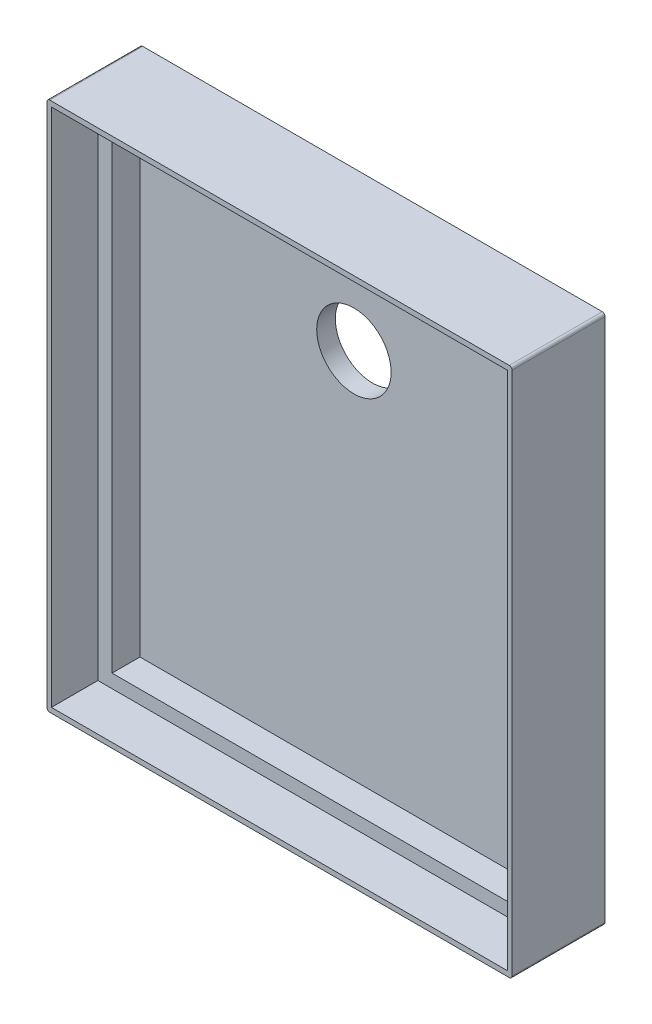
ISO-10303-21;
HEADER;
FILE_DESCRIPTION(('STEP AP214'),'2;1');
FILE_NAME('part.step','',(''),(''),'','','');
FILE_SCHEMA(('AUTOMOTIVE_DESIGN { 1 0 10303 214 1 1 1 1 }'));
ENDSEC;
DATA;
#1=APPLICATION_CONTEXT('core data for automotive mechanical design processes');
#2=APPLICATION_PROTOCOL_DEFINITION('international standard','automotive_design',2000,#1);
#3=PRODUCT_CONTEXT('',#1,'mechanical');
#4=PRODUCT('Part','Part','',(#3));
#5=PRODUCT_RELATED_PRODUCT_CATEGORY('part','',(#4));
#6=PRODUCT_DEFINITION_FORMATION('','',#4);
#7=PRODUCT_DEFINITION_CONTEXT('part definition',#1,'design');
#8=PRODUCT_DEFINITION('design','',#6,#7);
#9=PRODUCT_DEFINITION_SHAPE('','',#8);
#10=(LENGTH_UNIT() NAMED_UNIT(*) SI_UNIT(.MILLI.,.METRE.));
#11=(NAMED_UNIT(*) PLANE_ANGLE_UNIT() SI_UNIT($,.RADIAN.));
#12=(NAMED_UNIT(*) SI_UNIT($,.STERADIAN.) SOLID_ANGLE_UNIT());
#13=UNCERTAINTY_MEASURE_WITH_UNIT(LENGTH_MEASURE(1.E-05),#10,'distance_accuracy_value','');
#14=(GEOMETRIC_REPRESENTATION_CONTEXT(3) GLOBAL_UNCERTAINTY_ASSIGNED_CONTEXT((#13)) GLOBAL_UNIT_ASSIGNED_CONTEXT((#10,
#11,#12)) REPRESENTATION_CONTEXT('',''));
#15=CARTESIAN_POINT('',(0.,0.,0.));
#16=DIRECTION('',(0.,0.,1.));
#17=DIRECTION('',(1.,0.,0.));
#18=AXIS2_PLACEMENT_3D('',#15,#16,#17);
#19=CARTESIAN_POINT('',(497.,-567.,100.));
#20=DIRECTION('',(0.,0.,1.));
#21=DIRECTION('',(1.,0.,0.));
#22=AXIS2_PLACEMENT_3D('',#19,#20,#21);
#23=PLANE('',#22);
#24=CARTESIAN_POINT('',(497.,-567.,100.));
#25=DIRECTION('',(0.,0.,1.));
#26=DIRECTION('',(1.,0.,0.));
#27=AXIS2_PLACEMENT_3D('',#24,#25,#26);
#28=CIRCLE('',#27,3.);
#29=CARTESIAN_POINT('',(497.,-570.,100.));
#30=VERTEX_POINT('',#29);
#31=CARTESIAN_POINT('',(500.,-567.,100.));
#32=VERTEX_POINT('',#31);
#33=EDGE_CURVE('E243',#30,#32,#28,.T.);
#34=ORIENTED_EDGE('',*,*,#33,.T.);
#35=DIRECTION('',(0.,1.,0.));
#36=VECTOR('',#35,1.);
#37=CARTESIAN_POINT('',(500.,-3.00000000000002,100.));
#38=LINE('',#37,#36);
#39=CARTESIAN_POINT('',(500.,-3.00000000000002,100.));
#40=VERTEX_POINT('',#39);
#41=EDGE_CURVE('E247',#32,#40,#38,.T.);
#42=ORIENTED_EDGE('',*,*,#41,.T.);
#43=CARTESIAN_POINT('',(497.,-3.,100.));
#44=DIRECTION('',(0.,0.,1.));
#45=DIRECTION('',(-1.,0.,0.));
#46=AXIS2_PLACEMENT_3D('',#43,#44,#45);
#47=CIRCLE('',#46,3.);
#48=CARTESIAN_POINT('',(497.,0.,100.));
#49=VERTEX_POINT('',#48);
#50=EDGE_CURVE('E251',#40,#49,#47,.T.);
#51=ORIENTED_EDGE('',*,*,#50,.T.);
#52=DIRECTION('',(-1.,0.,0.));
#53=VECTOR('',#52,1.);
#54=CARTESIAN_POINT('',(3.00000000000002,0.,100.));
#55=LINE('',#54,#53);
#56=CARTESIAN_POINT('',(3.00000000000002,0.,100.));
#57=VERTEX_POINT('',#56);
#58=EDGE_CURVE('E254',#49,#57,#55,.T.);
#59=ORIENTED_EDGE('',*,*,#58,.T.);
#60=CARTESIAN_POINT('',(3.,-3.,100.));
#61=DIRECTION('',(0.,0.,1.));
#62=DIRECTION('',(-1.,0.,0.));
#63=AXIS2_PLACEMENT_3D('',#60,#61,#62);
#64=CIRCLE('',#63,3.);
#65=CARTESIAN_POINT('',(0.,-3.00000000000002,100.));
#66=VERTEX_POINT('',#65);
#67=EDGE_CURVE('E257',#57,#66,#64,.T.);
#68=ORIENTED_EDGE('',*,*,#67,.T.);
#69=DIRECTION('',(0.,-1.,0.));
#70=VECTOR('',#69,1.);
#71=CARTESIAN_POINT('',(0.,-3.00000000000002,100.));
#72=LINE('',#71,#70);
#73=CARTESIAN_POINT('',(0.,-567.,100.));
#74=VERTEX_POINT('',#73);
#75=EDGE_CURVE('E260',#66,#74,#72,.T.);
#76=ORIENTED_EDGE('',*,*,#75,.T.);
#77=CARTESIAN_POINT('',(3.00000000000007,-567.,100.));
#78=DIRECTION('',(0.,0.,1.));
#79=DIRECTION('',(-1.,0.,0.));
#80=AXIS2_PLACEMENT_3D('',#77,#78,#79);
#81=CIRCLE('',#80,3.);
#82=CARTESIAN_POINT('',(3.00000000000009,-570.,100.));
#83=VERTEX_POINT('',#82);
#84=EDGE_CURVE('E263',#74,#83,#81,.T.);
#85=ORIENTED_EDGE('',*,*,#84,.T.);
#86=DIRECTION('',(1.,0.,0.));
#87=VECTOR('',#86,1.);
#88=CARTESIAN_POINT('',(3.00000000000009,-570.,100.));
#89=LINE('',#88,#87);
#90=EDGE_CURVE('E266',#83,#30,#89,.T.);
#91=ORIENTED_EDGE('',*,*,#90,.T.);
#92=EDGE_LOOP('',(#34,#42,#51,#59,#68,#76,#85,#91));
#93=FACE_BOUND('',#92,.T.);
#94=DIRECTION('',(0.,-1.,0.));
#95=VECTOR('',#94,1.);
#96=CARTESIAN_POINT('',(4.78499999999998,0.,100.));
#97=LINE('',#96,#95);
#98=CARTESIAN_POINT('',(4.78499999999998,-5.48999999999999,100.));
#99=VERTEX_POINT('',#98);
#100=CARTESIAN_POINT('',(4.78499999999998,-564.51,100.));
#101=VERTEX_POINT('',#100);
#102=EDGE_CURVE('E185',#99,#101,#97,.T.);
#103=ORIENTED_EDGE('',*,*,#102,.F.);
#104=DIRECTION('',(1.,0.,0.));
#105=VECTOR('',#104,1.);
#106=CARTESIAN_POINT('',(0.,-5.48999999999994,100.));
#107=LINE('',#106,#105);
#108=CARTESIAN_POINT('',(495.215,-5.48999999999994,100.));
#109=VERTEX_POINT('',#108);
#110=EDGE_CURVE('E55',#99,#109,#107,.T.);
#111=ORIENTED_EDGE('',*,*,#110,.T.);
#112=DIRECTION('',(0.,1.,0.));
#113=VECTOR('',#112,1.);
#114=CARTESIAN_POINT('',(495.215,0.,100.));
#115=LINE('',#114,#113);
#116=CARTESIAN_POINT('',(495.215,-564.51,100.));
#117=VERTEX_POINT('',#116);
#118=EDGE_CURVE('E170',#117,#109,#115,.T.);
#119=ORIENTED_EDGE('',*,*,#118,.F.);
#120=DIRECTION('',(1.,0.,0.));
#121=VECTOR('',#120,1.);
#122=CARTESIAN_POINT('',(0.,-564.51,100.));
#123=LINE('',#122,#121);
#124=EDGE_CURVE('E189',#101,#117,#123,.T.);
#125=ORIENTED_EDGE('',*,*,#124,.F.);
#126=EDGE_LOOP('',(#103,#111,#119,#125));
#127=FACE_BOUND('',#126,.T.);
#128=ADVANCED_FACE('F39',(#93,#127),#23,.T.);
#129=CARTESIAN_POINT('',(497.,-567.,100.));
#130=DIRECTION('',(0.,0.,-1.));
#131=DIRECTION('',(-1.,0.,0.));
#132=AXIS2_PLACEMENT_3D('',#129,#130,#131);
#133=CYLINDRICAL_SURFACE('',#132,3.);
#134=CARTESIAN_POINT('',(497.,-567.,0.));
#135=DIRECTION('',(0.,0.,1.));
#136=DIRECTION('',(1.,0.,0.));
#137=AXIS2_PLACEMENT_3D('',#134,#135,#136);
#138=CIRCLE('',#137,3.);
#139=CARTESIAN_POINT('',(497.,-570.,0.));
#140=VERTEX_POINT('',#139);
#141=CARTESIAN_POINT('',(500.,-567.,0.));
#142=VERTEX_POINT('',#141);
#143=EDGE_CURVE('E226',#140,#142,#138,.T.);
#144=ORIENTED_EDGE('',*,*,#143,.T.);
#145=DIRECTION('',(0.,0.,-1.));
#146=VECTOR('',#145,1.);
#147=CARTESIAN_POINT('',(500.,-567.,100.));
#148=LINE('',#147,#146);
#149=EDGE_CURVE('E48',#32,#142,#148,.T.);
#150=ORIENTED_EDGE('',*,*,#149,.F.);
#151=ORIENTED_EDGE('',*,*,#33,.F.);
#152=DIRECTION('',(0.,0.,-1.));
#153=VECTOR('',#152,1.);
#154=CARTESIAN_POINT('',(497.,-570.,100.));
#155=LINE('',#154,#153);
#156=EDGE_CURVE('E269',#30,#140,#155,.T.);
#157=ORIENTED_EDGE('',*,*,#156,.T.);
#158=EDGE_LOOP('',(#144,#150,#151,#157));
#159=FACE_BOUND('',#158,.T.);
#160=ADVANCED_FACE('F41',(#159),#133,.T.);
#161=CARTESIAN_POINT('',(500.,-3.00000000000002,100.));
#162=DIRECTION('',(-1.,0.,0.));
#163=DIRECTION('',(0.,-1.,0.));
#164=AXIS2_PLACEMENT_3D('',#161,#162,#163);
#165=PLANE('',#164);
#166=DIRECTION('',(0.,1.,0.));
#167=VECTOR('',#166,1.);
#168=CARTESIAN_POINT('',(500.,-3.00000000000002,0.));
#169=LINE('',#168,#167);
#170=CARTESIAN_POINT('',(500.,-3.00000000000002,0.));
#171=VERTEX_POINT('',#170);
#172=EDGE_CURVE('E273',#142,#171,#169,.T.);
#173=ORIENTED_EDGE('',*,*,#172,.T.);
#174=DIRECTION('',(0.,0.,-1.));
#175=VECTOR('',#174,1.);
#176=CARTESIAN_POINT('',(500.,-3.00000000000002,100.));
#177=LINE('',#176,#175);
#178=EDGE_CURVE('E316',#40,#171,#177,.T.);
#179=ORIENTED_EDGE('',*,*,#178,.F.);
#180=ORIENTED_EDGE('',*,*,#41,.F.);
#181=ORIENTED_EDGE('',*,*,#149,.T.);
#182=EDGE_LOOP('',(#173,#179,#180,#181));
#183=FACE_BOUND('',#182,.T.);
#184=ADVANCED_FACE('F323',(#183),#165,.F.);
#185=CARTESIAN_POINT('',(497.,-3.,100.));
#186=DIRECTION('',(0.,0.,-1.));
#187=DIRECTION('',(-1.,0.,0.));
#188=AXIS2_PLACEMENT_3D('',#185,#186,#187);
#189=CYLINDRICAL_SURFACE('',#188,3.);
#190=CARTESIAN_POINT('',(497.,-3.,0.));
#191=DIRECTION('',(0.,0.,1.));
#192=DIRECTION('',(-1.,0.,0.));
#193=AXIS2_PLACEMENT_3D('',#190,#191,#192);
#194=CIRCLE('',#193,3.);
#195=CARTESIAN_POINT('',(497.,0.,0.));
#196=VERTEX_POINT('',#195);
#197=EDGE_CURVE('E276',#171,#196,#194,.T.);
#198=ORIENTED_EDGE('',*,*,#197,.T.);
#199=DIRECTION('',(0.,0.,-1.));
#200=VECTOR('',#199,1.);
#201=CARTESIAN_POINT('',(497.,0.,100.));
#202=LINE('',#201,#200);
#203=EDGE_CURVE('E312',#49,#196,#202,.T.);
#204=ORIENTED_EDGE('',*,*,#203,.F.);
#205=ORIENTED_EDGE('',*,*,#50,.F.);
#206=ORIENTED_EDGE('',*,*,#178,.T.);
#207=EDGE_LOOP('',(#198,#204,#205,#206));
#208=FACE_BOUND('',#207,.T.);
#209=ADVANCED_FACE('F339',(#208),#189,.T.);
#210=CARTESIAN_POINT('',(3.00000000000002,0.,100.));
#211=DIRECTION('',(0.,-1.,0.));
#212=DIRECTION('',(0.,0.,-1.));
#213=AXIS2_PLACEMENT_3D('',#210,#211,#212);
#214=PLANE('',#213);
#215=DIRECTION('',(-1.,0.,0.));
#216=VECTOR('',#215,1.);
#217=CARTESIAN_POINT('',(3.00000000000002,0.,0.));
#218=LINE('',#217,#216);
#219=CARTESIAN_POINT('',(3.00000000000002,0.,0.));
#220=VERTEX_POINT('',#219);
#221=EDGE_CURVE('E279',#196,#220,#218,.T.);
#222=ORIENTED_EDGE('',*,*,#221,.T.);
#223=DIRECTION('',(0.,0.,-1.));
#224=VECTOR('',#223,1.);
#225=CARTESIAN_POINT('',(3.00000000000002,0.,100.));
#226=LINE('',#225,#224);
#227=EDGE_CURVE('E308',#57,#220,#226,.T.);
#228=ORIENTED_EDGE('',*,*,#227,.F.);
#229=ORIENTED_EDGE('',*,*,#58,.F.);
#230=ORIENTED_EDGE('',*,*,#203,.T.);
#231=EDGE_LOOP('',(#222,#228,#229,#230));
#232=FACE_BOUND('',#231,.T.);
#233=ADVANCED_FACE('F343',(#232),#214,.F.);
#234=CARTESIAN_POINT('',(3.,-3.,100.));
#235=DIRECTION('',(0.,0.,-1.));
#236=DIRECTION('',(-1.,0.,0.));
#237=AXIS2_PLACEMENT_3D('',#234,#235,#236);
#238=CYLINDRICAL_SURFACE('',#237,3.);
#239=CARTESIAN_POINT('',(3.,-3.,0.));
#240=DIRECTION('',(0.,0.,1.));
#241=DIRECTION('',(-1.,0.,0.));
#242=AXIS2_PLACEMENT_3D('',#239,#240,#241);
#243=CIRCLE('',#242,3.);
#244=CARTESIAN_POINT('',(0.,-3.00000000000002,0.));
#245=VERTEX_POINT('',#244);
#246=EDGE_CURVE('E282',#220,#245,#243,.T.);
#247=ORIENTED_EDGE('',*,*,#246,.T.);
#248=DIRECTION('',(0.,0.,-1.));
#249=VECTOR('',#248,1.);
#250=CARTESIAN_POINT('',(0.,-3.00000000000002,100.));
#251=LINE('',#250,#249);
#252=EDGE_CURVE('E304',#66,#245,#251,.T.);
#253=ORIENTED_EDGE('',*,*,#252,.F.);
#254=ORIENTED_EDGE('',*,*,#67,.F.);
#255=ORIENTED_EDGE('',*,*,#227,.T.);
#256=EDGE_LOOP('',(#247,#253,#254,#255));
#257=FACE_BOUND('',#256,.T.);
#258=ADVANCED_FACE('F362',(#257),#238,.T.);
#259=CARTESIAN_POINT('',(0.,-3.00000000000002,100.));
#260=DIRECTION('',(1.,0.,0.));
#261=DIRECTION('',(0.,1.,0.));
#262=AXIS2_PLACEMENT_3D('',#259,#260,#261);
#263=PLANE('',#262);
#264=DIRECTION('',(0.,-1.,0.));
#265=VECTOR('',#264,1.);
#266=CARTESIAN_POINT('',(0.,-3.00000000000002,0.));
#267=LINE('',#266,#265);
#268=CARTESIAN_POINT('',(0.,-567.,0.));
#269=VERTEX_POINT('',#268);
#270=EDGE_CURVE('E285',#245,#269,#267,.T.);
#271=ORIENTED_EDGE('',*,*,#270,.T.);
#272=DIRECTION('',(0.,0.,-1.));
#273=VECTOR('',#272,1.);
#274=CARTESIAN_POINT('',(0.,-567.,100.));
#275=LINE('',#274,#273);
#276=EDGE_CURVE('E300',#74,#269,#275,.T.);
#277=ORIENTED_EDGE('',*,*,#276,.F.);
#278=ORIENTED_EDGE('',*,*,#75,.F.);
#279=ORIENTED_EDGE('',*,*,#252,.T.);
#280=EDGE_LOOP('',(#271,#277,#278,#279));
#281=FACE_BOUND('',#280,.T.);
#282=ADVANCED_FACE('F359',(#281),#263,.F.);
#283=CARTESIAN_POINT('',(3.00000000000007,-567.,100.));
#284=DIRECTION('',(0.,0.,-1.));
#285=DIRECTION('',(-1.,0.,0.));
#286=AXIS2_PLACEMENT_3D('',#283,#284,#285);
#287=CYLINDRICAL_SURFACE('',#286,3.);
#288=CARTESIAN_POINT('',(3.00000000000007,-567.,0.));
#289=DIRECTION('',(0.,0.,1.));
#290=DIRECTION('',(-1.,0.,0.));
#291=AXIS2_PLACEMENT_3D('',#288,#289,#290);
#292=CIRCLE('',#291,3.);
#293=CARTESIAN_POINT('',(3.00000000000009,-570.,0.));
#294=VERTEX_POINT('',#293);
#295=EDGE_CURVE('E288',#269,#294,#292,.T.);
#296=ORIENTED_EDGE('',*,*,#295,.T.);
#297=DIRECTION('',(0.,0.,-1.));
#298=VECTOR('',#297,1.);
#299=CARTESIAN_POINT('',(3.00000000000009,-570.,100.));
#300=LINE('',#299,#298);
#301=EDGE_CURVE('E296',#83,#294,#300,.T.);
#302=ORIENTED_EDGE('',*,*,#301,.F.);
#303=ORIENTED_EDGE('',*,*,#84,.F.);
#304=ORIENTED_EDGE('',*,*,#276,.T.);
#305=EDGE_LOOP('',(#296,#302,#303,#304));
#306=FACE_BOUND('',#305,.T.);
#307=ADVANCED_FACE('F355',(#306),#287,.T.);
#308=CARTESIAN_POINT('',(3.00000000000009,-570.,100.));
#309=DIRECTION('',(0.,1.,0.));
#310=DIRECTION('',(0.,0.,1.));
#311=AXIS2_PLACEMENT_3D('',#308,#309,#310);
#312=PLANE('',#311);
#313=DIRECTION('',(1.,0.,0.));
#314=VECTOR('',#313,1.);
#315=CARTESIAN_POINT('',(3.00000000000009,-570.,0.));
#316=LINE('',#315,#314);
#317=EDGE_CURVE('E248',#294,#140,#316,.T.);
#318=ORIENTED_EDGE('',*,*,#317,.T.);
#319=ORIENTED_EDGE('',*,*,#156,.F.);
#320=ORIENTED_EDGE('',*,*,#90,.F.);
#321=ORIENTED_EDGE('',*,*,#301,.T.);
#322=EDGE_LOOP('',(#318,#319,#320,#321));
#323=FACE_BOUND('',#322,.T.);
#324=ADVANCED_FACE('F353',(#323),#312,.F.);
#325=CARTESIAN_POINT('',(497.,-567.,0.));
#326=DIRECTION('',(0.,0.,1.));
#327=DIRECTION('',(1.,0.,0.));
#328=AXIS2_PLACEMENT_3D('',#325,#326,#327);
#329=PLANE('',#328);
#330=ORIENTED_EDGE('',*,*,#143,.F.);
#331=ORIENTED_EDGE('',*,*,#317,.F.);
#332=ORIENTED_EDGE('',*,*,#295,.F.);
#333=ORIENTED_EDGE('',*,*,#270,.F.);
#334=ORIENTED_EDGE('',*,*,#246,.F.);
#335=ORIENTED_EDGE('',*,*,#221,.F.);
#336=ORIENTED_EDGE('',*,*,#197,.F.);
#337=ORIENTED_EDGE('',*,*,#172,.F.);
#338=EDGE_LOOP('',(#330,#331,#332,#333,#334,#335,#336,#337));
#339=FACE_BOUND('',#338,.T.);
#340=CARTESIAN_POINT('',(250.,-150.,0.));
#341=DIRECTION('',(0.,0.,-1.));
#342=DIRECTION('',(-1.,0.,0.));
#343=AXIS2_PLACEMENT_3D('',#340,#341,#342);
#344=CIRCLE('',#343,40.);
#345=CARTESIAN_POINT('',(210.,-150.,0.));
#346=VERTEX_POINT('',#345);
#347=EDGE_CURVE('E566',#346,#346,#344,.T.);
#348=ORIENTED_EDGE('',*,*,#347,.F.);
#349=EDGE_LOOP('',(#348));
#350=FACE_BOUND('',#349,.T.);
#351=ADVANCED_FACE('F331',(#339,#350),#329,.F.);
#352=CARTESIAN_POINT('',(0.,-5.48999999999994,50.));
#353=DIRECTION('',(0.,-1.,0.));
#354=DIRECTION('',(0.,0.,-1.));
#355=AXIS2_PLACEMENT_3D('',#352,#353,#354);
#356=PLANE('',#355);
#357=ORIENTED_EDGE('',*,*,#110,.F.);
#358=DIRECTION('',(0.,0.,1.));
#359=VECTOR('',#358,1.);
#360=CARTESIAN_POINT('',(4.78499999999998,-5.48999999999994,50.));
#361=LINE('',#360,#359);
#362=CARTESIAN_POINT('',(4.78499999999998,-5.48999999999994,50.));
#363=VERTEX_POINT('',#362);
#364=EDGE_CURVE('E149',#363,#99,#361,.T.);
#365=ORIENTED_EDGE('',*,*,#364,.F.);
#366=DIRECTION('',(1.,0.,0.));
#367=VECTOR('',#366,1.);
#368=CARTESIAN_POINT('',(0.,-5.48999999999994,50.));
#369=LINE('',#368,#367);
#370=CARTESIAN_POINT('',(495.215,-5.48999999999994,50.));
#371=VERTEX_POINT('',#370);
#372=EDGE_CURVE('E152',#363,#371,#369,.T.);
#373=ORIENTED_EDGE('',*,*,#372,.T.);
#374=DIRECTION('',(0.,0.,1.));
#375=VECTOR('',#374,1.);
#376=CARTESIAN_POINT('',(495.215,-5.48999999999994,50.));
#377=LINE('',#376,#375);
#378=EDGE_CURVE('E196',#371,#109,#377,.T.);
#379=ORIENTED_EDGE('',*,*,#378,.T.);
#380=EDGE_LOOP('',(#357,#365,#373,#379));
#381=FACE_BOUND('',#380,.T.);
#382=ADVANCED_FACE('F151',(#381),#356,.T.);
#383=CARTESIAN_POINT('',(495.215,0.,50.));
#384=DIRECTION('',(1.,0.,0.));
#385=DIRECTION('',(0.,0.,-1.));
#386=AXIS2_PLACEMENT_3D('',#383,#384,#385);
#387=PLANE('',#386);
#388=ORIENTED_EDGE('',*,*,#118,.T.);
#389=ORIENTED_EDGE('',*,*,#378,.F.);
#390=DIRECTION('',(0.,1.,0.));
#391=VECTOR('',#390,1.);
#392=CARTESIAN_POINT('',(495.215,0.,50.));
#393=LINE('',#392,#391);
#394=CARTESIAN_POINT('',(495.215,-564.51,50.));
#395=VERTEX_POINT('',#394);
#396=EDGE_CURVE('E160',#395,#371,#393,.T.);
#397=ORIENTED_EDGE('',*,*,#396,.F.);
#398=DIRECTION('',(0.,0.,1.));
#399=VECTOR('',#398,1.);
#400=CARTESIAN_POINT('',(495.215,-564.51,50.));
#401=LINE('',#400,#399);
#402=EDGE_CURVE('E200',#395,#117,#401,.T.);
#403=ORIENTED_EDGE('',*,*,#402,.T.);
#404=EDGE_LOOP('',(#388,#389,#397,#403));
#405=FACE_BOUND('',#404,.T.);
#406=ADVANCED_FACE('F399',(#405),#387,.F.);
#407=CARTESIAN_POINT('',(0.,-564.51,50.));
#408=DIRECTION('',(0.,-1.,0.));
#409=DIRECTION('',(0.,0.,-1.));
#410=AXIS2_PLACEMENT_3D('',#407,#408,#409);
#411=PLANE('',#410);
#412=ORIENTED_EDGE('',*,*,#124,.T.);
#413=ORIENTED_EDGE('',*,*,#402,.F.);
#414=DIRECTION('',(1.,0.,0.));
#415=VECTOR('',#414,1.);
#416=CARTESIAN_POINT('',(0.,-564.51,50.));
#417=LINE('',#416,#415);
#418=CARTESIAN_POINT('',(4.78499999999998,-564.51,50.));
#419=VERTEX_POINT('',#418);
#420=EDGE_CURVE('E175',#419,#395,#417,.T.);
#421=ORIENTED_EDGE('',*,*,#420,.F.);
#422=DIRECTION('',(0.,0.,1.));
#423=VECTOR('',#422,1.);
#424=CARTESIAN_POINT('',(4.78499999999998,-564.51,50.));
#425=LINE('',#424,#423);
#426=EDGE_CURVE('E159',#419,#101,#425,.T.);
#427=ORIENTED_EDGE('',*,*,#426,.T.);
#428=EDGE_LOOP('',(#412,#413,#421,#427));
#429=FACE_BOUND('',#428,.T.);
#430=ADVANCED_FACE('F406',(#429),#411,.F.);
#431=CARTESIAN_POINT('',(4.78499999999998,0.,50.));
#432=DIRECTION('',(-1.,0.,0.));
#433=DIRECTION('',(0.,0.,1.));
#434=AXIS2_PLACEMENT_3D('',#431,#432,#433);
#435=PLANE('',#434);
#436=ORIENTED_EDGE('',*,*,#102,.T.);
#437=ORIENTED_EDGE('',*,*,#426,.F.);
#438=DIRECTION('',(0.,-1.,0.));
#439=VECTOR('',#438,1.);
#440=CARTESIAN_POINT('',(4.78499999999998,0.,50.));
#441=LINE('',#440,#439);
#442=EDGE_CURVE('E167',#363,#419,#441,.T.);
#443=ORIENTED_EDGE('',*,*,#442,.F.);
#444=ORIENTED_EDGE('',*,*,#364,.T.);
#445=EDGE_LOOP('',(#436,#437,#443,#444));
#446=FACE_BOUND('',#445,.T.);
#447=ADVANCED_FACE('F172',(#446),#435,.F.);
#448=CARTESIAN_POINT('',(0.,0.,50.));
#449=DIRECTION('',(0.,0.,1.));
#450=DIRECTION('',(1.,0.,0.));
#451=AXIS2_PLACEMENT_3D('',#448,#449,#450);
#452=PLANE('',#451);
#453=DIRECTION('',(1.,0.,0.));
#454=VECTOR('',#453,1.);
#455=CARTESIAN_POINT('',(3.00000000000009,-550.,50.));
#456=LINE('',#455,#454);
#457=CARTESIAN_POINT('',(20.0000000000001,-550.,50.));
#458=VERTEX_POINT('',#457);
#459=CARTESIAN_POINT('',(480.,-550.,50.));
#460=VERTEX_POINT('',#459);
#461=EDGE_CURVE('E11',#458,#460,#456,.T.);
#462=ORIENTED_EDGE('',*,*,#461,.F.);
#463=DIRECTION('',(0.,-1.,0.));
#464=VECTOR('',#463,1.);
#465=CARTESIAN_POINT('',(20.,-3.00000000000002,50.));
#466=LINE('',#465,#464);
#467=CARTESIAN_POINT('',(20.,-20.,50.));
#468=VERTEX_POINT('',#467);
#469=EDGE_CURVE('E199',#468,#458,#466,.T.);
#470=ORIENTED_EDGE('',*,*,#469,.F.);
#471=DIRECTION('',(-1.,0.,0.));
#472=VECTOR('',#471,1.);
#473=CARTESIAN_POINT('',(3.00000000000002,-20.,50.));
#474=LINE('',#473,#472);
#475=CARTESIAN_POINT('',(480.,-20.,50.));
#476=VERTEX_POINT('',#475);
#477=EDGE_CURVE('E208',#476,#468,#474,.T.);
#478=ORIENTED_EDGE('',*,*,#477,.F.);
#479=DIRECTION('',(0.,1.,0.));
#480=VECTOR('',#479,1.);
#481=CARTESIAN_POINT('',(480.,-3.00000000000002,50.));
#482=LINE('',#481,#480);
#483=EDGE_CURVE('E63',#460,#476,#482,.T.);
#484=ORIENTED_EDGE('',*,*,#483,.F.);
#485=EDGE_LOOP('',(#462,#470,#478,#484));
#486=FACE_BOUND('',#485,.T.);
#487=ORIENTED_EDGE('',*,*,#372,.F.);
#488=ORIENTED_EDGE('',*,*,#442,.T.);
#489=ORIENTED_EDGE('',*,*,#420,.T.);
#490=ORIENTED_EDGE('',*,*,#396,.T.);
#491=EDGE_LOOP('',(#487,#488,#489,#490));
#492=FACE_BOUND('',#491,.T.);
#493=ADVANCED_FACE('F165',(#486,#492),#452,.T.);
#494=CARTESIAN_POINT('',(497.,-567.,20.));
#495=DIRECTION('',(0.,0.,1.));
#496=DIRECTION('',(1.,0.,0.));
#497=AXIS2_PLACEMENT_3D('',#494,#495,#496);
#498=PLANE('',#497);
#499=DIRECTION('',(0.,1.,0.));
#500=VECTOR('',#499,1.);
#501=CARTESIAN_POINT('',(480.,-3.00000000000002,20.));
#502=LINE('',#501,#500);
#503=CARTESIAN_POINT('',(480.,-550.,20.));
#504=VERTEX_POINT('',#503);
#505=CARTESIAN_POINT('',(480.,-20.,20.));
#506=VERTEX_POINT('',#505);
#507=EDGE_CURVE('E214',#504,#506,#502,.T.);
#508=ORIENTED_EDGE('',*,*,#507,.T.);
#509=DIRECTION('',(-1.,0.,0.));
#510=VECTOR('',#509,1.);
#511=CARTESIAN_POINT('',(3.00000000000002,-20.,20.));
#512=LINE('',#511,#510);
#513=CARTESIAN_POINT('',(20.,-20.,20.));
#514=VERTEX_POINT('',#513);
#515=EDGE_CURVE('E218',#506,#514,#512,.T.);
#516=ORIENTED_EDGE('',*,*,#515,.T.);
#517=DIRECTION('',(0.,-1.,0.));
#518=VECTOR('',#517,1.);
#519=CARTESIAN_POINT('',(20.,-3.00000000000002,20.));
#520=LINE('',#519,#518);
#521=CARTESIAN_POINT('',(20.0000000000001,-550.,20.));
#522=VERTEX_POINT('',#521);
#523=EDGE_CURVE('E230',#514,#522,#520,.T.);
#524=ORIENTED_EDGE('',*,*,#523,.T.);
#525=DIRECTION('',(1.,0.,0.));
#526=VECTOR('',#525,1.);
#527=CARTESIAN_POINT('',(3.00000000000009,-550.,20.));
#528=LINE('',#527,#526);
#529=EDGE_CURVE('E237',#522,#504,#528,.T.);
#530=ORIENTED_EDGE('',*,*,#529,.T.);
#531=EDGE_LOOP('',(#508,#516,#524,#530));
#532=FACE_BOUND('',#531,.T.);
#533=CARTESIAN_POINT('',(250.,-150.,20.));
#534=DIRECTION('',(0.,0.,1.));
#535=DIRECTION('',(1.,0.,0.));
#536=AXIS2_PLACEMENT_3D('',#533,#534,#535);
#537=CIRCLE('',#536,40.);
#538=CARTESIAN_POINT('',(290.,-150.,20.));
#539=VERTEX_POINT('',#538);
#540=EDGE_CURVE('E186',#539,#539,#537,.F.);
#541=ORIENTED_EDGE('',*,*,#540,.T.);
#542=EDGE_LOOP('',(#541));
#543=FACE_BOUND('',#542,.T.);
#544=ADVANCED_FACE('F378',(#532,#543),#498,.T.);
#545=CARTESIAN_POINT('',(3.00000000000009,-550.,100.));
#546=DIRECTION('',(0.,1.,0.));
#547=DIRECTION('',(0.,0.,1.));
#548=AXIS2_PLACEMENT_3D('',#545,#546,#547);
#549=PLANE('',#548);
#550=DIRECTION('',(0.,0.,-1.));
#551=VECTOR('',#550,1.);
#552=CARTESIAN_POINT('',(20.0000000000001,-550.,100.));
#553=LINE('',#552,#551);
#554=EDGE_CURVE('E233',#458,#522,#553,.T.);
#555=ORIENTED_EDGE('',*,*,#554,.F.);
#556=ORIENTED_EDGE('',*,*,#461,.T.);
#557=DIRECTION('',(0.,0.,-1.));
#558=VECTOR('',#557,1.);
#559=CARTESIAN_POINT('',(480.,-550.,100.));
#560=LINE('',#559,#558);
#561=EDGE_CURVE('E222',#460,#504,#560,.T.);
#562=ORIENTED_EDGE('',*,*,#561,.T.);
#563=ORIENTED_EDGE('',*,*,#529,.F.);
#564=EDGE_LOOP('',(#555,#556,#562,#563));
#565=FACE_BOUND('',#564,.T.);
#566=ADVANCED_FACE('F431',(#565),#549,.T.);
#567=CARTESIAN_POINT('',(20.,-3.00000000000002,100.));
#568=DIRECTION('',(1.,0.,0.));
#569=DIRECTION('',(0.,1.,0.));
#570=AXIS2_PLACEMENT_3D('',#567,#568,#569);
#571=PLANE('',#570);
#572=DIRECTION('',(0.,0.,-1.));
#573=VECTOR('',#572,1.);
#574=CARTESIAN_POINT('',(20.,-20.,100.));
#575=LINE('',#574,#573);
#576=EDGE_CURVE('E223',#468,#514,#575,.T.);
#577=ORIENTED_EDGE('',*,*,#576,.F.);
#578=ORIENTED_EDGE('',*,*,#469,.T.);
#579=ORIENTED_EDGE('',*,*,#554,.T.);
#580=ORIENTED_EDGE('',*,*,#523,.F.);
#581=EDGE_LOOP('',(#577,#578,#579,#580));
#582=FACE_BOUND('',#581,.T.);
#583=ADVANCED_FACE('F434',(#582),#571,.T.);
#584=CARTESIAN_POINT('',(3.00000000000002,-20.,100.));
#585=DIRECTION('',(0.,-1.,0.));
#586=DIRECTION('',(0.,0.,-1.));
#587=AXIS2_PLACEMENT_3D('',#584,#585,#586);
#588=PLANE('',#587);
#589=DIRECTION('',(0.,0.,-1.));
#590=VECTOR('',#589,1.);
#591=CARTESIAN_POINT('',(480.,-20.,100.));
#592=LINE('',#591,#590);
#593=EDGE_CURVE('E219',#476,#506,#592,.T.);
#594=ORIENTED_EDGE('',*,*,#593,.F.);
#595=ORIENTED_EDGE('',*,*,#477,.T.);
#596=ORIENTED_EDGE('',*,*,#576,.T.);
#597=ORIENTED_EDGE('',*,*,#515,.F.);
#598=EDGE_LOOP('',(#594,#595,#596,#597));
#599=FACE_BOUND('',#598,.T.);
#600=ADVANCED_FACE('F441',(#599),#588,.T.);
#601=CARTESIAN_POINT('',(480.,-3.00000000000002,100.));
#602=DIRECTION('',(-1.,0.,0.));
#603=DIRECTION('',(0.,-1.,0.));
#604=AXIS2_PLACEMENT_3D('',#601,#602,#603);
#605=PLANE('',#604);
#606=ORIENTED_EDGE('',*,*,#561,.F.);
#607=ORIENTED_EDGE('',*,*,#483,.T.);
#608=ORIENTED_EDGE('',*,*,#593,.T.);
#609=ORIENTED_EDGE('',*,*,#507,.F.);
#610=EDGE_LOOP('',(#606,#607,#608,#609));
#611=FACE_BOUND('',#610,.T.);
#612=ADVANCED_FACE('F449',(#611),#605,.T.);
#613=CARTESIAN_POINT('',(250.,-150.,189.705627484771));
#614=DIRECTION('',(0.,0.,-1.));
#615=DIRECTION('',(-1.,0.,0.));
#616=AXIS2_PLACEMENT_3D('',#613,#614,#615);
#617=CYLINDRICAL_SURFACE('',#616,40.);
#618=ORIENTED_EDGE('',*,*,#347,.T.);
#619=EDGE_LOOP('',(#618));
#620=FACE_BOUND('',#619,.T.);
#621=ORIENTED_EDGE('',*,*,#540,.F.);
#622=EDGE_LOOP('',(#621));
#623=FACE_BOUND('',#622,.T.);
#624=ADVANCED_FACE('F456',(#620,#623),#617,.F.);
#625=CLOSED_SHELL('',(#128,#160,#184,#209,#233,#258,#282,#307,#324,#351,#382,#406,#430,#447,
#493,#544,#566,#583,#600,#612,#624));
#626=MANIFOLD_SOLID_BREP('B2',#625);
#627=ADVANCED_BREP_SHAPE_REPRESENTATION('',(#18,#626),#14);
#628=SHAPE_DEFINITION_REPRESENTATION(#9,#627);
ENDSEC;
END-ISO-10303-21;
